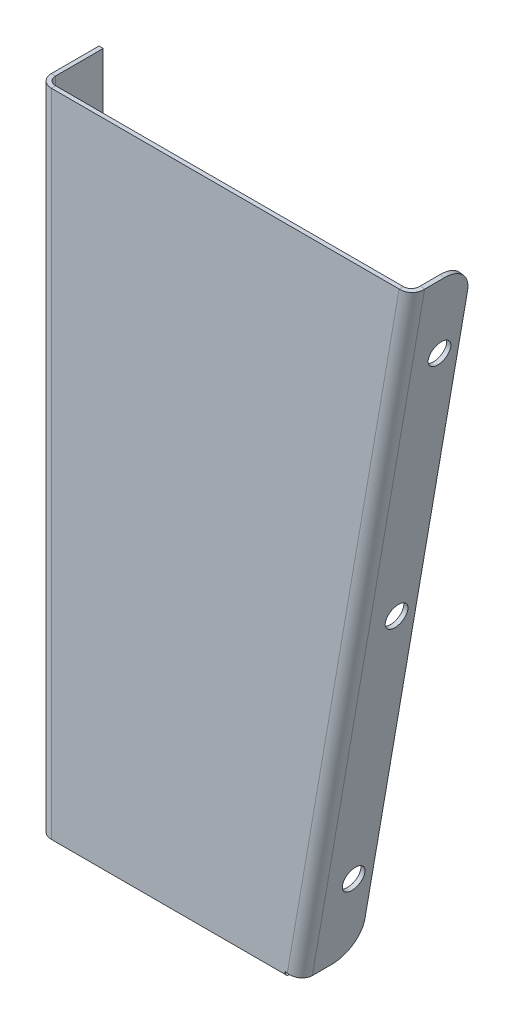
ISO-10303-21;
HEADER;
FILE_DESCRIPTION(('STEP AP214'),'2;1');
FILE_NAME('part.step','',(''),(''),'','','');
FILE_SCHEMA(('AUTOMOTIVE_DESIGN { 1 0 10303 214 1 1 1 1 }'));
ENDSEC;
DATA;
#1=APPLICATION_CONTEXT('core data for automotive mechanical design processes');
#2=APPLICATION_PROTOCOL_DEFINITION('international standard','automotive_design',2000,#1);
#3=PRODUCT_CONTEXT('',#1,'mechanical');
#4=PRODUCT('Part','Part','',(#3));
#5=PRODUCT_RELATED_PRODUCT_CATEGORY('part','',(#4));
#6=PRODUCT_DEFINITION_FORMATION('','',#4);
#7=PRODUCT_DEFINITION_CONTEXT('part definition',#1,'design');
#8=PRODUCT_DEFINITION('design','',#6,#7);
#9=PRODUCT_DEFINITION_SHAPE('','',#8);
#10=(LENGTH_UNIT() NAMED_UNIT(*) SI_UNIT(.MILLI.,.METRE.));
#11=(NAMED_UNIT(*) PLANE_ANGLE_UNIT() SI_UNIT($,.RADIAN.));
#12=(NAMED_UNIT(*) SI_UNIT($,.STERADIAN.) SOLID_ANGLE_UNIT());
#13=UNCERTAINTY_MEASURE_WITH_UNIT(LENGTH_MEASURE(1.E-05),#10,'distance_accuracy_value','');
#14=(GEOMETRIC_REPRESENTATION_CONTEXT(3) GLOBAL_UNCERTAINTY_ASSIGNED_CONTEXT((#13)) GLOBAL_UNIT_ASSIGNED_CONTEXT((#10,
#11,#12)) REPRESENTATION_CONTEXT('',''));
#15=CARTESIAN_POINT('',(0.,0.,0.));
#16=DIRECTION('',(0.,0.,1.));
#17=DIRECTION('',(1.,0.,0.));
#18=AXIS2_PLACEMENT_3D('',#15,#16,#17);
#19=CARTESIAN_POINT('',(135.953063944537,-62.3744510243497,1.5));
#20=DIRECTION('',(0.,-1.,0.));
#21=DIRECTION('',(1.,0.,0.));
#22=AXIS2_PLACEMENT_3D('',#19,#20,#21);
#23=PLANE('',#22);
#24=DIRECTION('',(0.,0.,1.));
#25=VECTOR('',#24,1.);
#26=CARTESIAN_POINT('',(131.386653634511,-62.3744510243496,0.));
#27=LINE('',#26,#25);
#28=CARTESIAN_POINT('',(131.386653634511,-62.3744510243496,0.));
#29=VERTEX_POINT('',#28);
#30=CARTESIAN_POINT('',(131.386653634511,-62.3744510243497,1.5));
#31=VERTEX_POINT('',#30);
#32=EDGE_CURVE('E263',#29,#31,#27,.T.);
#33=ORIENTED_EDGE('',*,*,#32,.F.);
#34=DIRECTION('',(-1.,0.,0.));
#35=VECTOR('',#34,1.);
#36=CARTESIAN_POINT('',(135.953063944537,-62.3744510243497,0.));
#37=LINE('',#36,#35);
#38=CARTESIAN_POINT('',(7.49999999999999,-62.3744510243497,0.));
#39=VERTEX_POINT('',#38);
#40=EDGE_CURVE('E352',#29,#39,#37,.T.);
#41=ORIENTED_EDGE('',*,*,#40,.T.);
#42=DIRECTION('',(0.,0.,1.));
#43=VECTOR('',#42,1.);
#44=CARTESIAN_POINT('',(7.49999999999999,-62.3744510243497,0.));
#45=LINE('',#44,#43);
#46=CARTESIAN_POINT('',(7.49999999999999,-62.3744510243497,1.49999999999998));
#47=VERTEX_POINT('',#46);
#48=EDGE_CURVE('E395',#39,#47,#45,.T.);
#49=ORIENTED_EDGE('',*,*,#48,.T.);
#50=DIRECTION('',(-1.,0.,0.));
#51=VECTOR('',#50,1.);
#52=CARTESIAN_POINT('',(135.953063944537,-62.3744510243497,1.5));
#53=LINE('',#52,#51);
#54=EDGE_CURVE('E351',#31,#47,#53,.T.);
#55=ORIENTED_EDGE('',*,*,#54,.F.);
#56=EDGE_LOOP('',(#33,#41,#49,#55));
#57=FACE_BOUND('',#56,.T.);
#58=ADVANCED_FACE('F80',(#57),#23,.F.);
#59=CARTESIAN_POINT('',(3.00000000000001,-294.07505479624,1.5));
#60=DIRECTION('',(0.,1.,0.));
#61=DIRECTION('',(0.,0.,1.));
#62=AXIS2_PLACEMENT_3D('',#59,#60,#61);
#63=PLANE('',#62);
#64=DIRECTION('',(0.,0.,1.));
#65=VECTOR('',#64,1.);
#66=CARTESIAN_POINT('',(91.5863208748659,-294.07505479624,0.));
#67=LINE('',#66,#65);
#68=CARTESIAN_POINT('',(91.5863208748658,-294.07505479624,0.));
#69=VERTEX_POINT('',#68);
#70=CARTESIAN_POINT('',(91.5863208748658,-294.07505479624,1.5));
#71=VERTEX_POINT('',#70);
#72=EDGE_CURVE('E372',#69,#71,#67,.T.);
#73=ORIENTED_EDGE('',*,*,#72,.T.);
#74=DIRECTION('',(1.,0.,0.));
#75=VECTOR('',#74,1.);
#76=CARTESIAN_POINT('',(3.00000000000001,-294.07505479624,1.5));
#77=LINE('',#76,#75);
#78=CARTESIAN_POINT('',(7.49999999999999,-294.07505479624,1.5));
#79=VERTEX_POINT('',#78);
#80=EDGE_CURVE('E346',#79,#71,#77,.T.);
#81=ORIENTED_EDGE('',*,*,#80,.F.);
#82=DIRECTION('',(0.,0.,1.));
#83=VECTOR('',#82,1.);
#84=CARTESIAN_POINT('',(7.49999999999999,-294.07505479624,0.));
#85=LINE('',#84,#83);
#86=CARTESIAN_POINT('',(7.49999999999999,-294.07505479624,0.));
#87=VERTEX_POINT('',#86);
#88=EDGE_CURVE('E385',#87,#79,#85,.T.);
#89=ORIENTED_EDGE('',*,*,#88,.F.);
#90=DIRECTION('',(1.,0.,0.));
#91=VECTOR('',#90,1.);
#92=CARTESIAN_POINT('',(3.00000000000001,-294.07505479624,0.));
#93=LINE('',#92,#91);
#94=EDGE_CURVE('E347',#87,#69,#93,.T.);
#95=ORIENTED_EDGE('',*,*,#94,.T.);
#96=EDGE_LOOP('',(#73,#81,#89,#95));
#97=FACE_BOUND('',#96,.T.);
#98=ADVANCED_FACE('F301',(#97),#63,.F.);
#99=CARTESIAN_POINT('',(0.,0.,1.5));
#100=DIRECTION('',(0.,0.,1.));
#101=DIRECTION('',(1.,0.,0.));
#102=AXIS2_PLACEMENT_3D('',#99,#100,#101);
#103=PLANE('',#102);
#104=ORIENTED_EDGE('',*,*,#80,.T.);
#105=DIRECTION('',(-0.985456779939458,0.169926263041812,0.));
#106=VECTOR('',#105,1.);
#107=CARTESIAN_POINT('',(-46.5997857229081,-270.247070478247,1.5));
#108=LINE('',#107,#106);
#109=CARTESIAN_POINT('',(90.6989072080366,-293.922034500225,1.5));
#110=VERTEX_POINT('',#109);
#111=EDGE_CURVE('E356',#71,#110,#108,.T.);
#112=ORIENTED_EDGE('',*,*,#111,.T.);
#113=DIRECTION('',(0.169926263041854,0.98545677993945,0.));
#114=VECTOR('',#113,1.);
#115=CARTESIAN_POINT('',(137.298692930955,-23.6749640219856,1.5));
#116=LINE('',#115,#114);
#117=CARTESIAN_POINT('',(90.8263519053179,-293.18294191527,1.5));
#118=VERTEX_POINT('',#117);
#119=EDGE_CURVE('E365',#110,#118,#116,.T.);
#120=ORIENTED_EDGE('',*,*,#119,.T.);
#121=DIRECTION('',(0.985456779939454,-0.169926263041836,0.));
#122=VECTOR('',#121,1.);
#123=CARTESIAN_POINT('',(-46.4723410256328,-269.507977893288,1.5));
#124=LINE('',#123,#122);
#125=CARTESIAN_POINT('',(91.5654444902725,-293.310386612552,1.49999999999999));
#126=VERTEX_POINT('',#125);
#127=EDGE_CURVE('E368',#118,#126,#124,.T.);
#128=ORIENTED_EDGE('',*,*,#127,.T.);
#129=DIRECTION('',(-0.169926263041851,-0.985456779939451,0.));
#130=VECTOR('',#129,1.);
#131=CARTESIAN_POINT('',(91.5654444902725,-293.310386612552,1.49999999999999));
#132=LINE('',#131,#130);
#133=EDGE_CURVE('E219',#126,#31,#132,.F.);
#134=ORIENTED_EDGE('',*,*,#133,.T.);
#135=ORIENTED_EDGE('',*,*,#54,.T.);
#136=DIRECTION('',(0.,1.,0.));
#137=VECTOR('',#136,1.);
#138=CARTESIAN_POINT('',(7.49999999999999,-62.3744510243497,1.49999999999998));
#139=LINE('',#138,#137);
#140=EDGE_CURVE('E419',#47,#79,#139,.F.);
#141=ORIENTED_EDGE('',*,*,#140,.T.);
#142=EDGE_LOOP('',(#104,#112,#120,#128,#134,#135,#141));
#143=FACE_BOUND('',#142,.T.);
#144=ADVANCED_FACE('F307',(#143),#103,.T.);
#145=CARTESIAN_POINT('',(0.,0.,0.));
#146=DIRECTION('',(0.,0.,1.));
#147=DIRECTION('',(1.,0.,0.));
#148=AXIS2_PLACEMENT_3D('',#145,#146,#147);
#149=PLANE('',#148);
#150=DIRECTION('',(-0.985456779939458,0.169926263041812,0.));
#151=VECTOR('',#150,1.);
#152=CARTESIAN_POINT('',(91.5863208748659,-294.07505479624,0.));
#153=LINE('',#152,#151);
#154=CARTESIAN_POINT('',(90.6989072080366,-293.922034500225,0.));
#155=VERTEX_POINT('',#154);
#156=EDGE_CURVE('E371',#69,#155,#153,.T.);
#157=ORIENTED_EDGE('',*,*,#156,.F.);
#158=ORIENTED_EDGE('',*,*,#94,.F.);
#159=DIRECTION('',(0.,1.,0.));
#160=VECTOR('',#159,1.);
#161=CARTESIAN_POINT('',(7.49999999999999,-62.3744510243497,0.));
#162=LINE('',#161,#160);
#163=EDGE_CURVE('E407',#39,#87,#162,.F.);
#164=ORIENTED_EDGE('',*,*,#163,.F.);
#165=ORIENTED_EDGE('',*,*,#40,.F.);
#166=DIRECTION('',(-0.169926263041851,-0.985456779939451,0.));
#167=VECTOR('',#166,1.);
#168=CARTESIAN_POINT('',(91.5654444902725,-293.310386612552,0.));
#169=LINE('',#168,#167);
#170=CARTESIAN_POINT('',(91.5654444902725,-293.310386612552,0.));
#171=VERTEX_POINT('',#170);
#172=EDGE_CURVE('E253',#171,#29,#169,.F.);
#173=ORIENTED_EDGE('',*,*,#172,.F.);
#174=DIRECTION('',(0.985456779939454,-0.169926263041836,0.));
#175=VECTOR('',#174,1.);
#176=CARTESIAN_POINT('',(90.8263519053179,-293.18294191527,0.));
#177=LINE('',#176,#175);
#178=CARTESIAN_POINT('',(90.8263519053179,-293.18294191527,0.));
#179=VERTEX_POINT('',#178);
#180=EDGE_CURVE('E380',#179,#171,#177,.T.);
#181=ORIENTED_EDGE('',*,*,#180,.F.);
#182=DIRECTION('',(0.169926263041854,0.98545677993945,0.));
#183=VECTOR('',#182,1.);
#184=CARTESIAN_POINT('',(90.6989072080366,-293.922034500225,0.));
#185=LINE('',#184,#183);
#186=EDGE_CURVE('E375',#155,#179,#185,.T.);
#187=ORIENTED_EDGE('',*,*,#186,.F.);
#188=EDGE_LOOP('',(#157,#158,#164,#165,#173,#181,#187));
#189=FACE_BOUND('',#188,.T.);
#190=ADVANCED_FACE('F527',(#189),#149,.F.);
#191=CARTESIAN_POINT('',(91.5863208748659,-294.07505479624,0.));
#192=DIRECTION('',(0.169926263041812,0.985456779939458,0.));
#193=DIRECTION('',(-0.985456779939458,0.169926263041812,0.));
#194=AXIS2_PLACEMENT_3D('',#191,#192,#193);
#195=PLANE('',#194);
#196=ORIENTED_EDGE('',*,*,#111,.F.);
#197=ORIENTED_EDGE('',*,*,#72,.F.);
#198=ORIENTED_EDGE('',*,*,#156,.T.);
#199=DIRECTION('',(0.,0.,1.));
#200=VECTOR('',#199,1.);
#201=CARTESIAN_POINT('',(90.6989072080366,-293.922034500225,0.));
#202=LINE('',#201,#200);
#203=EDGE_CURVE('E376',#155,#110,#202,.T.);
#204=ORIENTED_EDGE('',*,*,#203,.T.);
#205=EDGE_LOOP('',(#196,#197,#198,#204));
#206=FACE_BOUND('',#205,.T.);
#207=ADVANCED_FACE('F523',(#206),#195,.T.);
#208=CARTESIAN_POINT('',(90.6989072080366,-293.922034500225,0.));
#209=DIRECTION('',(0.98545677993945,-0.169926263041854,0.));
#210=DIRECTION('',(0.169926263041854,0.98545677993945,0.));
#211=AXIS2_PLACEMENT_3D('',#208,#209,#210);
#212=PLANE('',#211);
#213=ORIENTED_EDGE('',*,*,#119,.F.);
#214=ORIENTED_EDGE('',*,*,#203,.F.);
#215=ORIENTED_EDGE('',*,*,#186,.T.);
#216=DIRECTION('',(0.,0.,1.));
#217=VECTOR('',#216,1.);
#218=CARTESIAN_POINT('',(90.8263519053179,-293.18294191527,0.));
#219=LINE('',#218,#217);
#220=EDGE_CURVE('E381',#179,#118,#219,.T.);
#221=ORIENTED_EDGE('',*,*,#220,.T.);
#222=EDGE_LOOP('',(#213,#214,#215,#221));
#223=FACE_BOUND('',#222,.T.);
#224=ADVANCED_FACE('F519',(#223),#212,.T.);
#225=CARTESIAN_POINT('',(90.8263519053179,-293.18294191527,0.));
#226=DIRECTION('',(-0.169926263041836,-0.985456779939454,0.));
#227=DIRECTION('',(0.985456779939454,-0.169926263041836,0.));
#228=AXIS2_PLACEMENT_3D('',#225,#226,#227);
#229=PLANE('',#228);
#230=ORIENTED_EDGE('',*,*,#127,.F.);
#231=ORIENTED_EDGE('',*,*,#220,.F.);
#232=ORIENTED_EDGE('',*,*,#180,.T.);
#233=DIRECTION('',(0.,0.,1.));
#234=VECTOR('',#233,1.);
#235=CARTESIAN_POINT('',(91.5654444902725,-293.310386612552,0.));
#236=LINE('',#235,#234);
#237=EDGE_CURVE('E259',#171,#126,#236,.T.);
#238=ORIENTED_EDGE('',*,*,#237,.T.);
#239=EDGE_LOOP('',(#230,#231,#232,#238));
#240=FACE_BOUND('',#239,.T.);
#241=ADVANCED_FACE('F514',(#240),#229,.T.);
#242=CARTESIAN_POINT('',(7.5,-294.07505479624,-3.));
#243=DIRECTION('',(0.,-1.,0.));
#244=DIRECTION('',(0.,0.,-1.));
#245=AXIS2_PLACEMENT_3D('',#242,#243,#244);
#246=PLANE('',#245);
#247=DIRECTION('',(-1.,0.,0.));
#248=VECTOR('',#247,1.);
#249=CARTESIAN_POINT('',(3.,-294.07505479624,-2.99999999999999));
#250=LINE('',#249,#248);
#251=CARTESIAN_POINT('',(4.5,-294.07505479624,-2.99999999999999));
#252=VERTEX_POINT('',#251);
#253=CARTESIAN_POINT('',(3.,-294.07505479624,-2.99999999999998));
#254=VERTEX_POINT('',#253);
#255=EDGE_CURVE('E267',#252,#254,#250,.T.);
#256=ORIENTED_EDGE('',*,*,#255,.F.);
#257=CARTESIAN_POINT('',(7.5,-294.07505479624,-3.));
#258=DIRECTION('',(0.,1.,0.));
#259=DIRECTION('',(0.,0.,1.));
#260=AXIS2_PLACEMENT_3D('',#257,#258,#259);
#261=CIRCLE('',#260,2.99999999999999);
#262=EDGE_CURVE('E411',#87,#252,#261,.F.);
#263=ORIENTED_EDGE('',*,*,#262,.F.);
#264=ORIENTED_EDGE('',*,*,#88,.T.);
#265=CARTESIAN_POINT('',(7.5,-294.07505479624,-3.));
#266=DIRECTION('',(0.,1.,0.));
#267=DIRECTION('',(0.,0.,1.));
#268=AXIS2_PLACEMENT_3D('',#265,#266,#267);
#269=CIRCLE('',#268,4.49999999999999);
#270=EDGE_CURVE('E399',#79,#254,#269,.F.);
#271=ORIENTED_EDGE('',*,*,#270,.T.);
#272=EDGE_LOOP('',(#256,#263,#264,#271));
#273=FACE_BOUND('',#272,.T.);
#274=ADVANCED_FACE('F490',(#273),#246,.T.);
#275=CARTESIAN_POINT('',(7.5,-62.3744510243497,-3.00000000000001));
#276=DIRECTION('',(0.,-1.,0.));
#277=DIRECTION('',(0.,0.,-1.));
#278=AXIS2_PLACEMENT_3D('',#275,#276,#277);
#279=PLANE('',#278);
#280=CARTESIAN_POINT('',(7.5,-62.3744510243497,-3.00000000000001));
#281=DIRECTION('',(0.,1.,0.));
#282=DIRECTION('',(0.,0.,1.));
#283=AXIS2_PLACEMENT_3D('',#280,#281,#282);
#284=CIRCLE('',#283,2.99999999999999);
#285=CARTESIAN_POINT('',(4.5,-62.3744510243497,-3.));
#286=VERTEX_POINT('',#285);
#287=EDGE_CURVE('E403',#286,#39,#284,.T.);
#288=ORIENTED_EDGE('',*,*,#287,.F.);
#289=DIRECTION('',(-1.,0.,0.));
#290=VECTOR('',#289,1.);
#291=CARTESIAN_POINT('',(4.49999999999999,-62.3744510243497,-3.));
#292=LINE('',#291,#290);
#293=CARTESIAN_POINT('',(2.99999999999999,-62.3744510243497,-2.99999999999999));
#294=VERTEX_POINT('',#293);
#295=EDGE_CURVE('E432',#286,#294,#292,.T.);
#296=ORIENTED_EDGE('',*,*,#295,.T.);
#297=CARTESIAN_POINT('',(7.5,-62.3744510243497,-3.00000000000001));
#298=DIRECTION('',(0.,1.,0.));
#299=DIRECTION('',(0.,0.,1.));
#300=AXIS2_PLACEMENT_3D('',#297,#298,#299);
#301=CIRCLE('',#300,4.49999999999999);
#302=EDGE_CURVE('E415',#294,#47,#301,.T.);
#303=ORIENTED_EDGE('',*,*,#302,.T.);
#304=ORIENTED_EDGE('',*,*,#48,.F.);
#305=EDGE_LOOP('',(#288,#296,#303,#304));
#306=FACE_BOUND('',#305,.T.);
#307=ADVANCED_FACE('F483',(#306),#279,.F.);
#308=CARTESIAN_POINT('',(7.5,-62.3744510243497,-3.00000000000001));
#309=DIRECTION('',(0.,1.,0.));
#310=DIRECTION('',(-1.,0.,0.));
#311=AXIS2_PLACEMENT_3D('',#308,#309,#310);
#312=CYLINDRICAL_SURFACE('',#311,4.49999999999999);
#313=ORIENTED_EDGE('',*,*,#140,.F.);
#314=ORIENTED_EDGE('',*,*,#302,.F.);
#315=DIRECTION('',(0.,1.,0.));
#316=VECTOR('',#315,1.);
#317=CARTESIAN_POINT('',(2.99999999999999,0.,-3.));
#318=LINE('',#317,#316);
#319=EDGE_CURVE('E436',#254,#294,#318,.T.);
#320=ORIENTED_EDGE('',*,*,#319,.F.);
#321=ORIENTED_EDGE('',*,*,#270,.F.);
#322=EDGE_LOOP('',(#313,#314,#320,#321));
#323=FACE_BOUND('',#322,.T.);
#324=ADVANCED_FACE('F488',(#323),#312,.T.);
#325=CARTESIAN_POINT('',(7.5,-62.3744510243497,-3.00000000000001));
#326=DIRECTION('',(0.,1.,0.));
#327=DIRECTION('',(-1.,0.,0.));
#328=AXIS2_PLACEMENT_3D('',#325,#326,#327);
#329=CYLINDRICAL_SURFACE('',#328,2.99999999999999);
#330=ORIENTED_EDGE('',*,*,#163,.T.);
#331=ORIENTED_EDGE('',*,*,#262,.T.);
#332=DIRECTION('',(0.,-1.,0.));
#333=VECTOR('',#332,1.);
#334=CARTESIAN_POINT('',(4.5,-294.07505479624,-2.99999999999999));
#335=LINE('',#334,#333);
#336=EDGE_CURVE('E429',#252,#286,#335,.F.);
#337=ORIENTED_EDGE('',*,*,#336,.T.);
#338=ORIENTED_EDGE('',*,*,#287,.T.);
#339=EDGE_LOOP('',(#330,#331,#337,#338));
#340=FACE_BOUND('',#339,.T.);
#341=ADVANCED_FACE('F503',(#340),#329,.F.);
#342=CARTESIAN_POINT('',(3.,-62.3744510243497,0.));
#343=DIRECTION('',(0.,1.,0.));
#344=DIRECTION('',(-1.,0.,0.));
#345=AXIS2_PLACEMENT_3D('',#342,#343,#344);
#346=PLANE('',#345);
#347=DIRECTION('',(0.,0.,1.));
#348=VECTOR('',#347,1.);
#349=CARTESIAN_POINT('',(3.,-62.3744510243497,0.));
#350=LINE('',#349,#348);
#351=CARTESIAN_POINT('',(2.99999999999993,-62.3744510243497,-20.));
#352=VERTEX_POINT('',#351);
#353=EDGE_CURVE('E458',#352,#294,#350,.T.);
#354=ORIENTED_EDGE('',*,*,#353,.T.);
#355=ORIENTED_EDGE('',*,*,#295,.F.);
#356=DIRECTION('',(0.,0.,-1.));
#357=VECTOR('',#356,1.);
#358=CARTESIAN_POINT('',(4.5,-62.3744510243497,0.));
#359=LINE('',#358,#357);
#360=CARTESIAN_POINT('',(4.49999999999993,-62.3744510243497,-20.));
#361=VERTEX_POINT('',#360);
#362=EDGE_CURVE('E447',#361,#286,#359,.F.);
#363=ORIENTED_EDGE('',*,*,#362,.F.);
#364=DIRECTION('',(1.,0.,0.));
#365=VECTOR('',#364,1.);
#366=CARTESIAN_POINT('',(2.99999999999993,-62.3744510243497,-20.));
#367=LINE('',#366,#365);
#368=EDGE_CURVE('E408',#352,#361,#367,.T.);
#369=ORIENTED_EDGE('',*,*,#368,.F.);
#370=EDGE_LOOP('',(#354,#355,#363,#369));
#371=FACE_BOUND('',#370,.T.);
#372=ADVANCED_FACE('F480',(#371),#346,.T.);
#373=CARTESIAN_POINT('',(2.99999999999994,-294.07505479624,-20.));
#374=DIRECTION('',(0.,-1.,0.));
#375=DIRECTION('',(1.,0.,0.));
#376=AXIS2_PLACEMENT_3D('',#373,#374,#375);
#377=PLANE('',#376);
#378=DIRECTION('',(0.,0.,1.));
#379=VECTOR('',#378,1.);
#380=CARTESIAN_POINT('',(4.50000000000001,-294.07505479624,0.));
#381=LINE('',#380,#379);
#382=CARTESIAN_POINT('',(4.49999999999994,-294.07505479624,-20.));
#383=VERTEX_POINT('',#382);
#384=EDGE_CURVE('E440',#252,#383,#381,.F.);
#385=ORIENTED_EDGE('',*,*,#384,.F.);
#386=ORIENTED_EDGE('',*,*,#255,.T.);
#387=DIRECTION('',(0.,0.,-1.));
#388=VECTOR('',#387,1.);
#389=CARTESIAN_POINT('',(2.99999999999994,-294.07505479624,-20.));
#390=LINE('',#389,#388);
#391=CARTESIAN_POINT('',(2.99999999999994,-294.07505479624,-20.));
#392=VERTEX_POINT('',#391);
#393=EDGE_CURVE('E451',#254,#392,#390,.T.);
#394=ORIENTED_EDGE('',*,*,#393,.T.);
#395=DIRECTION('',(1.,0.,0.));
#396=VECTOR('',#395,1.);
#397=CARTESIAN_POINT('',(2.99999999999994,-294.07505479624,-20.));
#398=LINE('',#397,#396);
#399=EDGE_CURVE('E462',#392,#383,#398,.T.);
#400=ORIENTED_EDGE('',*,*,#399,.T.);
#401=EDGE_LOOP('',(#385,#386,#394,#400));
#402=FACE_BOUND('',#401,.T.);
#403=ADVANCED_FACE('F494',(#402),#377,.T.);
#404=CARTESIAN_POINT('',(3.,0.,0.));
#405=DIRECTION('',(-1.,0.,0.));
#406=DIRECTION('',(0.,0.,1.));
#407=AXIS2_PLACEMENT_3D('',#404,#405,#406);
#408=PLANE('',#407);
#409=CARTESIAN_POINT('',(2.99999999999997,-90.3289048412178,-10.));
#410=DIRECTION('',(-1.,0.,0.));
#411=DIRECTION('',(0.,0.,1.));
#412=AXIS2_PLACEMENT_3D('',#409,#410,#411);
#413=CIRCLE('',#412,4.);
#414=CARTESIAN_POINT('',(2.99999999999998,-90.3289048412178,-6.00000000000003));
#415=VERTEX_POINT('',#414);
#416=EDGE_CURVE('E599',#415,#415,#413,.T.);
#417=ORIENTED_EDGE('',*,*,#416,.F.);
#418=EDGE_LOOP('',(#417));
#419=FACE_BOUND('',#418,.T.);
#420=CARTESIAN_POINT('',(2.99999999999997,-150.328904841218,-10.));
#421=DIRECTION('',(-1.,0.,0.));
#422=DIRECTION('',(0.,0.,1.));
#423=AXIS2_PLACEMENT_3D('',#420,#421,#422);
#424=CIRCLE('',#423,4.);
#425=CARTESIAN_POINT('',(2.99999999999998,-150.328904841218,-6.00000000000003));
#426=VERTEX_POINT('',#425);
#427=EDGE_CURVE('E591',#426,#426,#424,.T.);
#428=ORIENTED_EDGE('',*,*,#427,.F.);
#429=EDGE_LOOP('',(#428));
#430=FACE_BOUND('',#429,.T.);
#431=CARTESIAN_POINT('',(2.99999999999997,-210.328904841218,-10.));
#432=DIRECTION('',(-1.,0.,0.));
#433=DIRECTION('',(0.,0.,1.));
#434=AXIS2_PLACEMENT_3D('',#431,#432,#433);
#435=CIRCLE('',#434,4.);
#436=CARTESIAN_POINT('',(2.99999999999999,-210.328904841218,-6.00000000000002));
#437=VERTEX_POINT('',#436);
#438=EDGE_CURVE('E583',#437,#437,#435,.T.);
#439=ORIENTED_EDGE('',*,*,#438,.F.);
#440=EDGE_LOOP('',(#439));
#441=FACE_BOUND('',#440,.T.);
#442=CARTESIAN_POINT('',(2.99999999999998,-270.328904841218,-10.));
#443=DIRECTION('',(-1.,0.,0.));
#444=DIRECTION('',(0.,0.,1.));
#445=AXIS2_PLACEMENT_3D('',#442,#443,#444);
#446=CIRCLE('',#445,4.);
#447=CARTESIAN_POINT('',(2.99999999999999,-270.328904841218,-6.00000000000002));
#448=VERTEX_POINT('',#447);
#449=EDGE_CURVE('E574',#448,#448,#446,.T.);
#450=ORIENTED_EDGE('',*,*,#449,.F.);
#451=EDGE_LOOP('',(#450));
#452=FACE_BOUND('',#451,.T.);
#453=ORIENTED_EDGE('',*,*,#393,.F.);
#454=ORIENTED_EDGE('',*,*,#319,.T.);
#455=ORIENTED_EDGE('',*,*,#353,.F.);
#456=DIRECTION('',(0.,1.,0.));
#457=VECTOR('',#456,1.);
#458=CARTESIAN_POINT('',(2.99999999999993,-62.3744510243497,-20.));
#459=LINE('',#458,#457);
#460=EDGE_CURVE('E454',#392,#352,#459,.T.);
#461=ORIENTED_EDGE('',*,*,#460,.F.);
#462=EDGE_LOOP('',(#453,#454,#455,#461));
#463=FACE_BOUND('',#462,.T.);
#464=ADVANCED_FACE('F486',(#419,#430,#441,#452,#463),#408,.T.);
#465=CARTESIAN_POINT('',(4.5,0.,0.));
#466=DIRECTION('',(-1.,0.,0.));
#467=DIRECTION('',(0.,0.,1.));
#468=AXIS2_PLACEMENT_3D('',#465,#466,#467);
#469=PLANE('',#468);
#470=CARTESIAN_POINT('',(4.49999999999997,-90.3289048412178,-10.));
#471=DIRECTION('',(-1.,0.,0.));
#472=DIRECTION('',(0.,0.,1.));
#473=AXIS2_PLACEMENT_3D('',#470,#471,#472);
#474=CIRCLE('',#473,4.);
#475=CARTESIAN_POINT('',(4.49999999999998,-90.3289048412178,-6.00000000000004));
#476=VERTEX_POINT('',#475);
#477=EDGE_CURVE('E249',#476,#476,#474,.T.);
#478=ORIENTED_EDGE('',*,*,#477,.T.);
#479=EDGE_LOOP('',(#478));
#480=FACE_BOUND('',#479,.T.);
#481=CARTESIAN_POINT('',(4.49999999999997,-150.328904841218,-10.));
#482=DIRECTION('',(-1.,0.,0.));
#483=DIRECTION('',(0.,0.,1.));
#484=AXIS2_PLACEMENT_3D('',#481,#482,#483);
#485=CIRCLE('',#484,4.);
#486=CARTESIAN_POINT('',(4.49999999999998,-150.328904841218,-6.00000000000004));
#487=VERTEX_POINT('',#486);
#488=EDGE_CURVE('E595',#487,#487,#485,.T.);
#489=ORIENTED_EDGE('',*,*,#488,.T.);
#490=EDGE_LOOP('',(#489));
#491=FACE_BOUND('',#490,.T.);
#492=CARTESIAN_POINT('',(4.49999999999997,-210.328904841218,-10.));
#493=DIRECTION('',(-1.,0.,0.));
#494=DIRECTION('',(0.,0.,1.));
#495=AXIS2_PLACEMENT_3D('',#492,#493,#494);
#496=CIRCLE('',#495,4.);
#497=CARTESIAN_POINT('',(4.49999999999999,-210.328904841218,-6.00000000000002));
#498=VERTEX_POINT('',#497);
#499=EDGE_CURVE('E587',#498,#498,#496,.T.);
#500=ORIENTED_EDGE('',*,*,#499,.T.);
#501=EDGE_LOOP('',(#500));
#502=FACE_BOUND('',#501,.T.);
#503=CARTESIAN_POINT('',(4.49999999999998,-270.328904841218,-10.));
#504=DIRECTION('',(-1.,0.,0.));
#505=DIRECTION('',(0.,0.,1.));
#506=AXIS2_PLACEMENT_3D('',#503,#504,#505);
#507=CIRCLE('',#506,4.);
#508=CARTESIAN_POINT('',(4.49999999999999,-270.328904841218,-6.00000000000002));
#509=VERTEX_POINT('',#508);
#510=EDGE_CURVE('E578',#509,#509,#507,.T.);
#511=ORIENTED_EDGE('',*,*,#510,.T.);
#512=EDGE_LOOP('',(#511));
#513=FACE_BOUND('',#512,.T.);
#514=ORIENTED_EDGE('',*,*,#336,.F.);
#515=ORIENTED_EDGE('',*,*,#384,.T.);
#516=DIRECTION('',(0.,-1.,0.));
#517=VECTOR('',#516,1.);
#518=CARTESIAN_POINT('',(4.49999999999993,0.,-20.));
#519=LINE('',#518,#517);
#520=EDGE_CURVE('E443',#383,#361,#519,.F.);
#521=ORIENTED_EDGE('',*,*,#520,.T.);
#522=ORIENTED_EDGE('',*,*,#362,.T.);
#523=EDGE_LOOP('',(#514,#515,#521,#522));
#524=FACE_BOUND('',#523,.T.);
#525=ADVANCED_FACE('F477',(#480,#491,#502,#513,#524),#469,.F.);
#526=CARTESIAN_POINT('',(2.99999999999993,-62.3744510243497,-20.));
#527=DIRECTION('',(0.,0.,-1.));
#528=DIRECTION('',(-1.,0.,0.));
#529=AXIS2_PLACEMENT_3D('',#526,#527,#528);
#530=PLANE('',#529);
#531=ORIENTED_EDGE('',*,*,#520,.F.);
#532=ORIENTED_EDGE('',*,*,#399,.F.);
#533=ORIENTED_EDGE('',*,*,#460,.T.);
#534=ORIENTED_EDGE('',*,*,#368,.T.);
#535=EDGE_LOOP('',(#531,#532,#533,#534));
#536=FACE_BOUND('',#535,.T.);
#537=ADVANCED_FACE('F469',(#536),#530,.T.);
#538=CARTESIAN_POINT('',(131.386653634511,-62.3744510243497,1.51500000000002));
#539=CARTESIAN_POINT('',(131.980164158944,-62.411163695619,1.51500000000001));
#540=CARTESIAN_POINT('',(132.573234075715,-62.4478237739833,1.39748663515745));
#541=CARTESIAN_POINT('',(133.671375979898,-62.505946712148,0.945145543419475));
#542=CARTESIAN_POINT('',(134.175918816162,-62.5273300197149,0.610495793427775));
#543=CARTESIAN_POINT('',(135.021556493261,-62.5419126417703,-0.22532155931327));
#544=CARTESIAN_POINT('',(135.36232725832,-62.5350560745736,-0.726160303625399));
#545=CARTESIAN_POINT('',(135.830065654068,-62.4844760086315,-1.81820830211786));
#546=CARTESIAN_POINT('',(135.956855938424,-62.4407336207672,-2.40888258269707));
#547=CARTESIAN_POINT('',(135.967845796236,-62.3769999182953,-3.));
#548=CARTESIAN_POINT('',(131.386653634511,-62.3744510243497,1.50000000000002));
#549=CARTESIAN_POINT('',(131.978228863973,-62.4108299866634,1.50000000000001));
#550=CARTESIAN_POINT('',(132.569364957306,-62.4471566063855,1.38287704500743));
#551=CARTESIAN_POINT('',(133.663931558818,-62.5046630407781,0.932038747594161));
#552=CARTESIAN_POINT('',(134.166834677685,-62.525763605301,0.598500790791802));
#553=CARTESIAN_POINT('',(135.009735936588,-62.5398743757972,-0.234539760112893));
#554=CARTESIAN_POINT('',(135.349411077511,-62.5328288857385,-0.733714588330963));
#555=CARTESIAN_POINT('',(135.815668534403,-62.4819934555727,-1.82213452038325));
#556=CARTESIAN_POINT('',(135.942074087012,-62.4381847251567,-2.41084643816312));
#557=CARTESIAN_POINT('',(135.953063944537,-62.3744510243496,-3.));
#558=CARTESIAN_POINT('',(131.386653634511,-62.3744510243496,0.));
#559=CARTESIAN_POINT('',(131.784699366881,-62.3774590910987,0.));
#560=CARTESIAN_POINT('',(132.182453116391,-62.3804398466131,-0.0780819699950431));
#561=CARTESIAN_POINT('',(132.919489450749,-62.376295903781,-0.378640834937223));
#562=CARTESIAN_POINT('',(133.258420830002,-62.3691221639161,-0.600999472805459));
#563=CARTESIAN_POINT('',(133.827680269287,-62.3360477784864,-1.15635984007526));
#564=CARTESIAN_POINT('',(134.057792996577,-62.3101100022337,-1.48914305888731));
#565=CARTESIAN_POINT('',(134.375956567855,-62.233738149696,-2.21475634692216));
#566=CARTESIAN_POINT('',(134.463888945811,-62.1832951641084,-2.60723198476853));
#567=CARTESIAN_POINT('',(134.474878774627,-62.1195616297869,-3.));
#568=CARTESIAN_POINT('',(131.386653634511,-62.3744510243496,-0.0151499999999796));
#569=CARTESIAN_POINT('',(131.78274471896,-62.3771220450535,-0.015149999999985));
#570=CARTESIAN_POINT('',(132.178545306797,-62.3797660073394,-0.092837656046568));
#571=CARTESIAN_POINT('',(132.911970585457,-62.3749993956973,-0.39187869872079));
#572=CARTESIAN_POINT('',(133.24924585014,-62.3675400853581,-0.613114425467791));
#573=CARTESIAN_POINT('',(133.815741507047,-62.3339891298535,-1.16567022288288));
#574=CARTESIAN_POINT('',(134.04474765396,-62.3078605415103,-1.49677288643992));
#575=CARTESIAN_POINT('',(134.361415476993,-62.2312307711067,-2.21872182737021));
#576=CARTESIAN_POINT('',(134.448959275885,-62.1807207795418,-2.60921547878925));
#577=CARTESIAN_POINT('',(134.459949104411,-62.1169872469018,-3.));
#578=B_SPLINE_SURFACE_WITH_KNOTS('',1,3,((#538,#539,#540,#541,#542,#543,#544,#545,#546,#547),
(#548,#549,#550,#551,#552,#553,#554,#555,#556,#557),(#558,#559,#560,#561,#562,#563,#564,#565,
#566,#567),(#568,#569,#570,#571,#572,#573,#574,#575,#576,#577)),.UNSPECIFIED.,.F.,.F.,.F.,(2,1,
1,2),(4,2,2,2,4),(-0.01,0.,1.,1.0101),(0.,0.25,0.5,0.75,1.),.UNSPECIFIED.);
#579=DIRECTION('',(0.985456779939451,-0.169926263041851,0.));
#580=VECTOR('',#579,1.);
#581=CARTESIAN_POINT('',(135.953063944537,-62.3744510243496,-3.));
#582=LINE('',#581,#580);
#583=CARTESIAN_POINT('',(134.474878774627,-62.1195616297868,-3.));
#584=VERTEX_POINT('',#583);
#585=CARTESIAN_POINT('',(135.953063944537,-62.3744510243496,-3.));
#586=VERTEX_POINT('',#585);
#587=EDGE_CURVE('E246',#584,#586,#582,.T.);
#588=CARTESIAN_POINT('',(131.386653634511,-62.3744510243496,0.));
#589=CARTESIAN_POINT('',(131.473323347612,-62.3751053938988,8.55121583674698E-06));
#590=CARTESIAN_POINT('',(131.559989091523,-62.3757598170839,-0.00365683537831571));
#591=CARTESIAN_POINT('',(131.732701110115,-62.3769631687007,-0.0182694302827804));
#592=CARTESIAN_POINT('',(131.81874741515,-62.3775121023361,-0.0292162793000287));
#593=CARTESIAN_POINT('',(131.989552338697,-62.3783986190093,-0.0583146227482495));
#594=CARTESIAN_POINT('',(132.074311891945,-62.3787363634114,-0.0764605991387528));
#595=CARTESIAN_POINT('',(132.241982897415,-62.3790960691108,-0.119806285482669));
#596=CARTESIAN_POINT('',(132.324894372692,-62.37911803435,-0.145005907380935));
#597=CARTESIAN_POINT('',(132.57006768472,-62.3785573264704,-0.230977889592989));
#598=CARTESIAN_POINT('',(132.728828488181,-62.377348500665,-0.302133662461352));
#599=CARTESIAN_POINT('',(133.032055077761,-62.3724908695212,-0.469943571922529));
#600=CARTESIAN_POINT('',(133.176523622176,-62.3688425360476,-0.566592775226828));
#601=CARTESIAN_POINT('',(133.447242066846,-62.3583965871664,-0.782601634993479));
#602=CARTESIAN_POINT('',(133.573492394403,-62.3515990456382,-0.901960758649903));
#603=CARTESIAN_POINT('',(133.804234225536,-62.3342493678824,-1.15994215106147));
#604=CARTESIAN_POINT('',(133.908720488399,-62.3236963289973,-1.29856904606155));
#605=CARTESIAN_POINT('',(134.093016568357,-62.2983281864745,-1.59103459939972));
#606=CARTESIAN_POINT('',(134.172820214917,-62.2835120188596,-1.74487704888597));
#607=CARTESIAN_POINT('',(134.305486547145,-62.2492442779468,-2.06322737597267));
#608=CARTESIAN_POINT('',(134.358369143495,-62.2297961461003,-2.22772726957254));
#609=CARTESIAN_POINT('',(134.420148140435,-62.1949233537305,-2.49459133668824));
#610=CARTESIAN_POINT('',(134.438184940832,-62.1810597634785,-2.59513476646379));
#611=CARTESIAN_POINT('',(134.464125809782,-62.1516115941386,-2.79710415072873));
#612=CARTESIAN_POINT('',(134.47204604765,-62.13602980467,-2.89852843541473));
#613=CARTESIAN_POINT('',(134.474878774627,-62.1195616297869,-3.));
#614=B_SPLINE_CURVE_WITH_KNOTS('',3,(#588,#589,#590,#591,#592,#593,#594,#595,#596,#597,#598,
#599,#600,#601,#602,#603,#604,#605,#606,#607,#608,#609,#610,#611,#612,#613),.UNSPECIFIED.,.F.,
.F.,(4,2,2,2,2,2,2,2,2,2,2,2,4),(0.,0.259931930276734,0.519851035545676,0.779571299806771,
1.03928832195907,1.5585417964192,2.07769486264646,2.59683575033121,3.1161015011928,
3.63549696120946,4.15450771862658,4.46329273489904,4.77158359959474),.UNSPECIFIED.);
#615=EDGE_CURVE('E223',#29,#584,#614,.T.);
#616=CARTESIAN_POINT('',(131.386653634511,-62.3744510243497,1.50000000000002));
#617=CARTESIAN_POINT('',(131.514506021694,-62.3823127722903,1.50001393746033));
#618=CARTESIAN_POINT('',(131.642356413152,-62.3901743957816,1.49459636740683));
#619=CARTESIAN_POINT('',(131.897148474053,-62.4057422506915,1.47299887254831));
#620=CARTESIAN_POINT('',(132.024090187345,-62.4134484896416,1.45681947066336));
#621=CARTESIAN_POINT('',(132.276076999208,-62.4285454891275,1.41381529683206));
#622=CARTESIAN_POINT('',(132.401123465469,-62.4359364849017,1.38699862210756));
#623=CARTESIAN_POINT('',(132.648535394822,-62.4502550765179,1.32291738490632));
#624=CARTESIAN_POINT('',(132.77090089092,-62.4571826780668,1.28565295112889));
#625=CARTESIAN_POINT('',(133.012130482014,-62.4704293475069,1.20092841058296));
#626=CARTESIAN_POINT('',(133.13099337666,-62.4767482084268,1.1534648537169));
#627=CARTESIAN_POINT('',(133.364379667423,-62.4886320987893,1.04867191291524));
#628=CARTESIAN_POINT('',(133.478901443256,-62.4941968487241,0.991338888683493));
#629=CARTESIAN_POINT('',(133.702689585704,-62.5044293438468,0.867266072051054));
#630=CARTESIAN_POINT('',(133.811958822124,-62.5090975831312,0.800531496516272));
#631=CARTESIAN_POINT('',(134.024580139793,-62.5174083771875,0.658085409266204));
#632=CARTESIAN_POINT('',(134.127930027322,-62.5210505536335,0.582370600979305));
#633=CARTESIAN_POINT('',(134.327903755871,-62.5271793297614,0.422559642087971));
#634=CARTESIAN_POINT('',(134.424530179,-62.5296663751708,0.338466739556327));
#635=CARTESIAN_POINT('',(134.610457601806,-62.5333723285482,0.162446965237237));
#636=CARTESIAN_POINT('',(134.699755857417,-62.5345907634571,0.070517184927573));
#637=CARTESIAN_POINT('',(134.870348553513,-62.5356497462083,-0.120473576281468));
#638=CARTESIAN_POINT('',(134.951644175232,-62.5354904977134,-0.219533500984134));
#639=CARTESIAN_POINT('',(135.105706022684,-62.5336974100737,-0.424120248086038));
#640=CARTESIAN_POINT('',(135.178469214345,-62.5320630481745,-0.529649350689448));
#641=CARTESIAN_POINT('',(135.314929006811,-62.5272293641368,-0.746387378068182));
#642=CARTESIAN_POINT('',(135.378625236526,-62.5240299779691,-0.857596535062321));
#643=CARTESIAN_POINT('',(135.496506301073,-62.5159906856849,-1.08488965175466));
#644=CARTESIAN_POINT('',(135.550691102766,-62.5111507738527,-1.20097362843569));
#645=CARTESIAN_POINT('',(135.649149127029,-62.4997690686421,-1.43711939970563));
#646=CARTESIAN_POINT('',(135.693427673223,-62.4932281934685,-1.55717901776506));
#647=CARTESIAN_POINT('',(135.771800574469,-62.4783957390041,-1.80043227067488));
#648=CARTESIAN_POINT('',(135.805897347578,-62.4701045761867,-1.92362515385619));
#649=CARTESIAN_POINT('',(135.871127547503,-62.4493595563054,-2.20433868609232));
#650=CARTESIAN_POINT('',(135.899238498421,-62.4363835540318,-2.3625322837838));
#651=CARTESIAN_POINT('',(135.938723440018,-62.4075714163612,-2.68049151762488));
#652=CARTESIAN_POINT('',(135.950122628117,-62.3917396273853,-2.84025442068946));
#653=CARTESIAN_POINT('',(135.953063944537,-62.3744510243496,-3.));
#654=B_SPLINE_CURVE_WITH_KNOTS('',3,(#616,#617,#618,#619,#620,#621,#622,#623,#624,#625,#626,
#627,#628,#629,#630,#631,#632,#633,#634,#635,#636,#637,#638,#639,#640,#641,#642,#643,#644,#645,
#646,#647,#648,#649,#650,#651,#652,#653),.UNSPECIFIED.,.F.,.F.,(4,2,2,2,2,2,2,2,2,2,2,2,2,2,2,2,
2,2,4),(0.,0.384164283207455,0.76830990114149,1.15216366217932,1.53601269497465,
1.91999177887843,2.30411279591062,2.68802149987885,3.07207157240543,3.45597332909462,
3.84001818982016,4.22400627814243,4.60813049851544,4.99227043570679,5.37641171127057,
5.76034605070888,6.14418913740547,6.62684535251156,7.1087730841141),.UNSPECIFIED.);
#655=EDGE_CURVE('E258',#31,#586,#654,.T.);
#656=ORIENTED_EDGE('',*,*,#587,.F.);
#657=ORIENTED_EDGE('',*,*,#615,.F.);
#658=ORIENTED_EDGE('',*,*,#32,.T.);
#659=ORIENTED_EDGE('',*,*,#655,.T.);
#660=EDGE_LOOP('',(#656,#657,#658,#659));
#661=FACE_BOUND('',#660,.T.);
#662=ADVANCED_FACE('F282',(#661),#578,.F.);
#663=CARTESIAN_POINT('',(91.5654444902726,-293.310386612552,-3.00000000000004));
#664=DIRECTION('',(0.169926263041851,0.985456779939451,0.));
#665=DIRECTION('',(-0.985456779939451,0.169926263041851,0.));
#666=AXIS2_PLACEMENT_3D('',#663,#664,#665);
#667=PLANE('',#666);
#668=CARTESIAN_POINT('',(91.5654444902726,-293.310386612552,-3.00000000000004));
#669=DIRECTION('',(-0.169926263041851,-0.985456779939451,0.));
#670=DIRECTION('',(0.985456779939451,-0.169926263041851,0.));
#671=AXIS2_PLACEMENT_3D('',#668,#669,#670);
#672=CIRCLE('',#671,3.00000000000003);
#673=CARTESIAN_POINT('',(94.5218148300909,-293.820165401677,-3.00000000000003));
#674=VERTEX_POINT('',#673);
#675=EDGE_CURVE('E209',#674,#171,#672,.T.);
#676=ORIENTED_EDGE('',*,*,#675,.F.);
#677=DIRECTION('',(0.985456779939451,-0.169926263041851,0.));
#678=VECTOR('',#677,1.);
#679=CARTESIAN_POINT('',(94.5218148300909,-293.820165401677,-3.00000000000003));
#680=LINE('',#679,#678);
#681=CARTESIAN_POINT('',(96.,-294.07505479624,-3.00000000000003));
#682=VERTEX_POINT('',#681);
#683=EDGE_CURVE('E205',#674,#682,#680,.T.);
#684=ORIENTED_EDGE('',*,*,#683,.T.);
#685=CARTESIAN_POINT('',(91.5654444902726,-293.310386612552,-3.00000000000004));
#686=DIRECTION('',(-0.169926263041851,-0.985456779939451,0.));
#687=DIRECTION('',(0.985456779939451,-0.169926263041851,0.));
#688=AXIS2_PLACEMENT_3D('',#685,#686,#687);
#689=CIRCLE('',#688,4.50000000000003);
#690=EDGE_CURVE('E214',#682,#126,#689,.T.);
#691=ORIENTED_EDGE('',*,*,#690,.T.);
#692=ORIENTED_EDGE('',*,*,#237,.F.);
#693=EDGE_LOOP('',(#676,#684,#691,#692));
#694=FACE_BOUND('',#693,.T.);
#695=ADVANCED_FACE('F226',(#694),#667,.F.);
#696=CARTESIAN_POINT('',(91.5654444902725,-293.310386612552,-3.00000000000004));
#697=DIRECTION('',(-0.169926263041851,-0.985456779939451,0.));
#698=DIRECTION('',(0.985456779939451,-0.169926263041851,0.));
#699=AXIS2_PLACEMENT_3D('',#696,#697,#698);
#700=CYLINDRICAL_SURFACE('',#699,4.50000000000003);
#701=ORIENTED_EDGE('',*,*,#133,.F.);
#702=ORIENTED_EDGE('',*,*,#690,.F.);
#703=DIRECTION('',(-0.169926263041851,-0.985456779939451,0.));
#704=VECTOR('',#703,1.);
#705=CARTESIAN_POINT('',(135.953063944537,-62.3744510243496,-3.));
#706=LINE('',#705,#704);
#707=EDGE_CURVE('E216',#682,#586,#706,.F.);
#708=ORIENTED_EDGE('',*,*,#707,.T.);
#709=ORIENTED_EDGE('',*,*,#655,.F.);
#710=EDGE_LOOP('',(#701,#702,#708,#709));
#711=FACE_BOUND('',#710,.T.);
#712=ADVANCED_FACE('F215',(#711),#700,.T.);
#713=CARTESIAN_POINT('',(91.5654444902725,-293.310386612552,-3.00000000000004));
#714=DIRECTION('',(-0.169926263041851,-0.985456779939451,0.));
#715=DIRECTION('',(0.985456779939451,-0.169926263041851,0.));
#716=AXIS2_PLACEMENT_3D('',#713,#714,#715);
#717=CYLINDRICAL_SURFACE('',#716,3.00000000000003);
#718=ORIENTED_EDGE('',*,*,#172,.T.);
#719=ORIENTED_EDGE('',*,*,#615,.T.);
#720=DIRECTION('',(-0.169926263041851,-0.985456779939451,0.));
#721=VECTOR('',#720,1.);
#722=CARTESIAN_POINT('',(134.474878774627,-62.1195616297869,-3.));
#723=LINE('',#722,#721);
#724=EDGE_CURVE('E229',#584,#674,#723,.T.);
#725=ORIENTED_EDGE('',*,*,#724,.T.);
#726=ORIENTED_EDGE('',*,*,#675,.T.);
#727=EDGE_LOOP('',(#718,#719,#725,#726));
#728=FACE_BOUND('',#727,.T.);
#729=ADVANCED_FACE('F290',(#728),#717,.F.);
#730=CARTESIAN_POINT('',(135.953063944537,-62.3744510243496,0.));
#731=DIRECTION('',(0.169926263041851,0.985456779939451,0.));
#732=DIRECTION('',(-0.985456779939451,0.169926263041851,0.));
#733=AXIS2_PLACEMENT_3D('',#730,#731,#732);
#734=PLANE('',#733);
#735=DIRECTION('',(0.,0.,1.));
#736=VECTOR('',#735,1.);
#737=CARTESIAN_POINT('',(135.953063944537,-62.3744510243496,0.));
#738=LINE('',#737,#736);
#739=CARTESIAN_POINT('',(135.953063944537,-62.3744510243497,-9.99999999999999));
#740=VERTEX_POINT('',#739);
#741=EDGE_CURVE('E232',#586,#740,#738,.F.);
#742=ORIENTED_EDGE('',*,*,#741,.T.);
#743=DIRECTION('',(-0.985456779939451,0.169926263041851,0.));
#744=VECTOR('',#743,1.);
#745=CARTESIAN_POINT('',(135.953063944537,-62.3744510243497,-9.99999999999999));
#746=LINE('',#745,#744);
#747=CARTESIAN_POINT('',(134.474878774627,-62.1195616297869,-10.));
#748=VERTEX_POINT('',#747);
#749=EDGE_CURVE('E13',#740,#748,#746,.T.);
#750=ORIENTED_EDGE('',*,*,#749,.T.);
#751=DIRECTION('',(0.,0.,-1.));
#752=VECTOR('',#751,1.);
#753=CARTESIAN_POINT('',(134.474878774627,-62.1195616297869,4.20626524446144E-13));
#754=LINE('',#753,#752);
#755=EDGE_CURVE('E234',#584,#748,#754,.T.);
#756=ORIENTED_EDGE('',*,*,#755,.F.);
#757=ORIENTED_EDGE('',*,*,#587,.T.);
#758=EDGE_LOOP('',(#742,#750,#756,#757));
#759=FACE_BOUND('',#758,.T.);
#760=ADVANCED_FACE('F291',(#759),#734,.T.);
#761=CARTESIAN_POINT('',(96.0000000000001,-294.07505479624,-20.));
#762=DIRECTION('',(-0.169926263041851,-0.985456779939451,0.));
#763=DIRECTION('',(0.985456779939451,-0.169926263041851,0.));
#764=AXIS2_PLACEMENT_3D('',#761,#762,#763);
#765=PLANE('',#764);
#766=DIRECTION('',(0.,0.,1.));
#767=VECTOR('',#766,1.);
#768=CARTESIAN_POINT('',(94.5218148300909,-293.820165401677,1.03153526586914E-12));
#769=LINE('',#768,#767);
#770=CARTESIAN_POINT('',(94.5218148300909,-293.820165401677,-9.99999999999998));
#771=VERTEX_POINT('',#770);
#772=EDGE_CURVE('E563',#771,#674,#769,.T.);
#773=ORIENTED_EDGE('',*,*,#772,.F.);
#774=DIRECTION('',(-0.985456779939451,0.169926263041851,0.));
#775=VECTOR('',#774,1.);
#776=CARTESIAN_POINT('',(96.0000000000001,-294.07505479624,-9.99999999999997));
#777=LINE('',#776,#775);
#778=CARTESIAN_POINT('',(96.0000000000001,-294.07505479624,-9.99999999999997));
#779=VERTEX_POINT('',#778);
#780=EDGE_CURVE('E104',#771,#779,#777,.F.);
#781=ORIENTED_EDGE('',*,*,#780,.T.);
#782=DIRECTION('',(0.,0.,-1.));
#783=VECTOR('',#782,1.);
#784=CARTESIAN_POINT('',(96.0000000000001,-294.07505479624,-20.));
#785=LINE('',#784,#783);
#786=EDGE_CURVE('E201',#779,#682,#785,.F.);
#787=ORIENTED_EDGE('',*,*,#786,.T.);
#788=ORIENTED_EDGE('',*,*,#683,.F.);
#789=EDGE_LOOP('',(#773,#781,#787,#788));
#790=FACE_BOUND('',#789,.T.);
#791=ADVANCED_FACE('F203',(#790),#765,.T.);
#792=CARTESIAN_POINT('',(142.472341025637,-24.5670769029547,4.1772423947141E-13));
#793=DIRECTION('',(-0.985456779939451,0.169926263041851,0.));
#794=DIRECTION('',(-0.169926263041851,-0.985456779939451,0.));
#795=AXIS2_PLACEMENT_3D('',#792,#793,#794);
#796=PLANE('',#795);
#797=CARTESIAN_POINT('',(100.683168298502,-266.915863104845,-13.));
#798=DIRECTION('',(0.985456779939451,-0.169926263041851,0.));
#799=DIRECTION('',(0.169926263041851,0.985456779939451,0.));
#800=AXIS2_PLACEMENT_3D('',#797,#798,#799);
#801=CIRCLE('',#800,4.);
#802=CARTESIAN_POINT('',(101.362873350669,-262.974035985087,-13.));
#803=VERTEX_POINT('',#802);
#804=EDGE_CURVE('E614',#803,#803,#801,.T.);
#805=ORIENTED_EDGE('',*,*,#804,.F.);
#806=EDGE_LOOP('',(#805));
#807=FACE_BOUND('',#806,.T.);
#808=CARTESIAN_POINT('',(131.269895646035,-89.5336427157441,-13.));
#809=DIRECTION('',(0.985456779939451,-0.169926263041851,0.));
#810=DIRECTION('',(0.169926263041851,0.985456779939451,0.));
#811=AXIS2_PLACEMENT_3D('',#808,#809,#810);
#812=CIRCLE('',#811,3.99999999999999);
#813=CARTESIAN_POINT('',(131.949600698202,-85.5918155959863,-13.));
#814=VERTEX_POINT('',#813);
#815=EDGE_CURVE('E622',#814,#814,#812,.T.);
#816=ORIENTED_EDGE('',*,*,#815,.F.);
#817=EDGE_LOOP('',(#816));
#818=FACE_BOUND('',#817,.T.);
#819=CARTESIAN_POINT('',(115.976531972268,-178.224752910295,-13.));
#820=DIRECTION('',(0.985456779939451,-0.169926263041851,0.));
#821=DIRECTION('',(0.169926263041851,0.985456779939451,0.));
#822=AXIS2_PLACEMENT_3D('',#819,#820,#821);
#823=CIRCLE('',#822,4.);
#824=CARTESIAN_POINT('',(116.656237024436,-174.282925790537,-13.));
#825=VERTEX_POINT('',#824);
#826=EDGE_CURVE('E606',#825,#825,#823,.T.);
#827=ORIENTED_EDGE('',*,*,#826,.F.);
#828=EDGE_LOOP('',(#827));
#829=FACE_BOUND('',#828,.T.);
#830=ORIENTED_EDGE('',*,*,#786,.F.);
#831=CARTESIAN_POINT('',(97.6992626304186,-284.220486996845,-9.99999999999999));
#832=DIRECTION('',(-0.985456779939451,0.169926263041851,0.));
#833=DIRECTION('',(-0.169926263041851,-0.985456779939451,0.));
#834=AXIS2_PLACEMENT_3D('',#831,#832,#833);
#835=CIRCLE('',#834,10.);
#836=CARTESIAN_POINT('',(97.6992626304186,-284.220486996845,-20.));
#837=VERTEX_POINT('',#836);
#838=EDGE_CURVE('E89',#779,#837,#835,.F.);
#839=ORIENTED_EDGE('',*,*,#838,.T.);
#840=DIRECTION('',(0.169926263041851,0.985456779939451,0.));
#841=VECTOR('',#840,1.);
#842=CARTESIAN_POINT('',(135.953063944537,-62.3744510243497,-20.));
#843=LINE('',#842,#841);
#844=CARTESIAN_POINT('',(134.253801314118,-72.2290188237442,-20.));
#845=VERTEX_POINT('',#844);
#846=EDGE_CURVE('E210',#845,#837,#843,.F.);
#847=ORIENTED_EDGE('',*,*,#846,.F.);
#848=CARTESIAN_POINT('',(134.253801314118,-72.2290188237442,-9.99999999999999));
#849=DIRECTION('',(-0.985456779939451,0.169926263041851,0.));
#850=DIRECTION('',(-0.169926263041851,-0.985456779939451,0.));
#851=AXIS2_PLACEMENT_3D('',#848,#849,#850);
#852=CIRCLE('',#851,10.);
#853=EDGE_CURVE('E96',#845,#740,#852,.F.);
#854=ORIENTED_EDGE('',*,*,#853,.T.);
#855=ORIENTED_EDGE('',*,*,#741,.F.);
#856=ORIENTED_EDGE('',*,*,#707,.F.);
#857=EDGE_LOOP('',(#830,#839,#847,#854,#855,#856));
#858=FACE_BOUND('',#857,.T.);
#859=ADVANCED_FACE('F231',(#807,#818,#829,#858),#796,.F.);
#860=CARTESIAN_POINT('',(140.994155855727,-24.312187508392,4.12487017463146E-13));
#861=DIRECTION('',(-0.985456779939451,0.169926263041851,0.));
#862=DIRECTION('',(-0.169926263041851,-0.985456779939451,0.));
#863=AXIS2_PLACEMENT_3D('',#860,#861,#862);
#864=PLANE('',#863);
#865=CARTESIAN_POINT('',(99.2049831285926,-266.660973710283,-13.));
#866=DIRECTION('',(0.985456779939451,-0.169926263041851,0.));
#867=DIRECTION('',(0.169926263041851,0.985456779939451,0.));
#868=AXIS2_PLACEMENT_3D('',#865,#866,#867);
#869=CIRCLE('',#868,4.);
#870=CARTESIAN_POINT('',(99.88468818076,-262.719146590525,-13.));
#871=VERTEX_POINT('',#870);
#872=EDGE_CURVE('E618',#871,#871,#869,.T.);
#873=ORIENTED_EDGE('',*,*,#872,.T.);
#874=EDGE_LOOP('',(#873));
#875=FACE_BOUND('',#874,.T.);
#876=CARTESIAN_POINT('',(129.791710476126,-89.2787533211814,-13.));
#877=DIRECTION('',(0.985456779939451,-0.169926263041851,0.));
#878=DIRECTION('',(0.169926263041851,0.985456779939451,0.));
#879=AXIS2_PLACEMENT_3D('',#876,#877,#878);
#880=CIRCLE('',#879,3.99999999999999);
#881=CARTESIAN_POINT('',(130.471415528293,-85.3369262014236,-13.));
#882=VERTEX_POINT('',#881);
#883=EDGE_CURVE('E610',#882,#882,#880,.T.);
#884=ORIENTED_EDGE('',*,*,#883,.T.);
#885=EDGE_LOOP('',(#884));
#886=FACE_BOUND('',#885,.T.);
#887=CARTESIAN_POINT('',(114.498346802359,-177.969863515732,-13.));
#888=DIRECTION('',(0.985456779939451,-0.169926263041851,0.));
#889=DIRECTION('',(0.169926263041851,0.985456779939451,0.));
#890=AXIS2_PLACEMENT_3D('',#887,#888,#889);
#891=CIRCLE('',#890,4.);
#892=CARTESIAN_POINT('',(115.178051854527,-174.028036395974,-13.));
#893=VERTEX_POINT('',#892);
#894=EDGE_CURVE('E579',#893,#893,#891,.T.);
#895=ORIENTED_EDGE('',*,*,#894,.T.);
#896=EDGE_LOOP('',(#895));
#897=FACE_BOUND('',#896,.T.);
#898=DIRECTION('',(-0.169926263041851,-0.985456779939451,0.));
#899=VECTOR('',#898,1.);
#900=CARTESIAN_POINT('',(140.994155855727,-24.312187508392,-20.));
#901=LINE('',#900,#899);
#902=CARTESIAN_POINT('',(132.775616144209,-71.9741294291814,-20.));
#903=VERTEX_POINT('',#902);
#904=CARTESIAN_POINT('',(96.2210774605094,-283.965597602283,-20.));
#905=VERTEX_POINT('',#904);
#906=EDGE_CURVE('E239',#903,#905,#901,.T.);
#907=ORIENTED_EDGE('',*,*,#906,.T.);
#908=CARTESIAN_POINT('',(96.2210774605094,-283.965597602283,-10.));
#909=DIRECTION('',(-0.985456779939451,0.169926263041851,0.));
#910=DIRECTION('',(-0.169926263041851,-0.985456779939451,0.));
#911=AXIS2_PLACEMENT_3D('',#908,#909,#910);
#912=CIRCLE('',#911,10.);
#913=EDGE_CURVE('E335',#905,#771,#912,.T.);
#914=ORIENTED_EDGE('',*,*,#913,.T.);
#915=ORIENTED_EDGE('',*,*,#772,.T.);
#916=ORIENTED_EDGE('',*,*,#724,.F.);
#917=ORIENTED_EDGE('',*,*,#755,.T.);
#918=CARTESIAN_POINT('',(132.775616144209,-71.9741294291814,-10.));
#919=DIRECTION('',(-0.985456779939451,0.169926263041851,0.));
#920=DIRECTION('',(-0.169926263041851,-0.985456779939451,0.));
#921=AXIS2_PLACEMENT_3D('',#918,#919,#920);
#922=CIRCLE('',#921,10.);
#923=EDGE_CURVE('E338',#748,#903,#922,.T.);
#924=ORIENTED_EDGE('',*,*,#923,.T.);
#925=EDGE_LOOP('',(#907,#914,#915,#916,#917,#924));
#926=FACE_BOUND('',#925,.T.);
#927=ADVANCED_FACE('F631',(#875,#886,#897,#926),#864,.T.);
#928=CARTESIAN_POINT('',(135.953063944537,-62.3744510243497,-20.));
#929=DIRECTION('',(0.,0.,-1.));
#930=DIRECTION('',(-1.,0.,0.));
#931=AXIS2_PLACEMENT_3D('',#928,#929,#930);
#932=PLANE('',#931);
#933=ORIENTED_EDGE('',*,*,#846,.T.);
#934=DIRECTION('',(-0.985456779939451,0.169926263041851,0.));
#935=VECTOR('',#934,1.);
#936=CARTESIAN_POINT('',(97.6992626304186,-284.220486996845,-20.));
#937=LINE('',#936,#935);
#938=EDGE_CURVE('E326',#837,#905,#937,.T.);
#939=ORIENTED_EDGE('',*,*,#938,.T.);
#940=ORIENTED_EDGE('',*,*,#906,.F.);
#941=DIRECTION('',(-0.985456779939451,0.169926263041851,0.));
#942=VECTOR('',#941,1.);
#943=CARTESIAN_POINT('',(134.253801314118,-72.2290188237442,-20.));
#944=LINE('',#943,#942);
#945=EDGE_CURVE('E343',#903,#845,#944,.F.);
#946=ORIENTED_EDGE('',*,*,#945,.T.);
#947=EDGE_LOOP('',(#933,#939,#940,#946));
#948=FACE_BOUND('',#947,.T.);
#949=ADVANCED_FACE('F667',(#948),#932,.T.);
#950=CARTESIAN_POINT('',(4.49999999999998,-270.328904841218,-10.));
#951=DIRECTION('',(-1.,0.,0.));
#952=DIRECTION('',(0.,0.,1.));
#953=AXIS2_PLACEMENT_3D('',#950,#951,#952);
#954=CYLINDRICAL_SURFACE('',#953,4.);
#955=ORIENTED_EDGE('',*,*,#510,.F.);
#956=EDGE_LOOP('',(#955));
#957=FACE_BOUND('',#956,.T.);
#958=ORIENTED_EDGE('',*,*,#449,.T.);
#959=EDGE_LOOP('',(#958));
#960=FACE_BOUND('',#959,.T.);
#961=ADVANCED_FACE('F664',(#957,#960),#954,.F.);
#962=CARTESIAN_POINT('',(4.49999999999997,-210.328904841218,-10.));
#963=DIRECTION('',(-1.,0.,0.));
#964=DIRECTION('',(0.,0.,1.));
#965=AXIS2_PLACEMENT_3D('',#962,#963,#964);
#966=CYLINDRICAL_SURFACE('',#965,4.);
#967=ORIENTED_EDGE('',*,*,#499,.F.);
#968=EDGE_LOOP('',(#967));
#969=FACE_BOUND('',#968,.T.);
#970=ORIENTED_EDGE('',*,*,#438,.T.);
#971=EDGE_LOOP('',(#970));
#972=FACE_BOUND('',#971,.T.);
#973=ADVANCED_FACE('F660',(#969,#972),#966,.F.);
#974=CARTESIAN_POINT('',(4.49999999999997,-150.328904841218,-10.));
#975=DIRECTION('',(-1.,0.,0.));
#976=DIRECTION('',(0.,0.,1.));
#977=AXIS2_PLACEMENT_3D('',#974,#975,#976);
#978=CYLINDRICAL_SURFACE('',#977,4.);
#979=ORIENTED_EDGE('',*,*,#488,.F.);
#980=EDGE_LOOP('',(#979));
#981=FACE_BOUND('',#980,.T.);
#982=ORIENTED_EDGE('',*,*,#427,.T.);
#983=EDGE_LOOP('',(#982));
#984=FACE_BOUND('',#983,.T.);
#985=ADVANCED_FACE('F653',(#981,#984),#978,.F.);
#986=CARTESIAN_POINT('',(4.49999999999997,-90.3289048412178,-10.));
#987=DIRECTION('',(-1.,0.,0.));
#988=DIRECTION('',(0.,0.,1.));
#989=AXIS2_PLACEMENT_3D('',#986,#987,#988);
#990=CYLINDRICAL_SURFACE('',#989,4.);
#991=ORIENTED_EDGE('',*,*,#477,.F.);
#992=EDGE_LOOP('',(#991));
#993=FACE_BOUND('',#992,.T.);
#994=ORIENTED_EDGE('',*,*,#416,.T.);
#995=EDGE_LOOP('',(#994));
#996=FACE_BOUND('',#995,.T.);
#997=ADVANCED_FACE('F647',(#993,#996),#990,.F.);
#998=CARTESIAN_POINT('',(114.498346802359,-177.969863515732,-13.));
#999=DIRECTION('',(0.985456779939451,-0.169926263041851,0.));
#1000=DIRECTION('',(0.169926263041851,0.985456779939451,0.));
#1001=AXIS2_PLACEMENT_3D('',#998,#999,#1000);
#1002=CYLINDRICAL_SURFACE('',#1001,4.);
#1003=ORIENTED_EDGE('',*,*,#894,.F.);
#1004=EDGE_LOOP('',(#1003));
#1005=FACE_BOUND('',#1004,.T.);
#1006=ORIENTED_EDGE('',*,*,#826,.T.);
#1007=EDGE_LOOP('',(#1006));
#1008=FACE_BOUND('',#1007,.T.);
#1009=ADVANCED_FACE('F636',(#1005,#1008),#1002,.F.);
#1010=CARTESIAN_POINT('',(129.791710476126,-89.2787533211814,-13.));
#1011=DIRECTION('',(0.985456779939451,-0.169926263041851,0.));
#1012=DIRECTION('',(0.169926263041851,0.985456779939451,0.));
#1013=AXIS2_PLACEMENT_3D('',#1010,#1011,#1012);
#1014=CYLINDRICAL_SURFACE('',#1013,3.99999999999999);
#1015=ORIENTED_EDGE('',*,*,#883,.F.);
#1016=EDGE_LOOP('',(#1015));
#1017=FACE_BOUND('',#1016,.T.);
#1018=ORIENTED_EDGE('',*,*,#815,.T.);
#1019=EDGE_LOOP('',(#1018));
#1020=FACE_BOUND('',#1019,.T.);
#1021=ADVANCED_FACE('F321',(#1017,#1020),#1014,.F.);
#1022=CARTESIAN_POINT('',(99.2049831285926,-266.660973710283,-13.));
#1023=DIRECTION('',(0.985456779939451,-0.169926263041851,0.));
#1024=DIRECTION('',(0.169926263041851,0.985456779939451,0.));
#1025=AXIS2_PLACEMENT_3D('',#1022,#1023,#1024);
#1026=CYLINDRICAL_SURFACE('',#1025,4.);
#1027=ORIENTED_EDGE('',*,*,#872,.F.);
#1028=EDGE_LOOP('',(#1027));
#1029=FACE_BOUND('',#1028,.T.);
#1030=ORIENTED_EDGE('',*,*,#804,.T.);
#1031=EDGE_LOOP('',(#1030));
#1032=FACE_BOUND('',#1031,.T.);
#1033=ADVANCED_FACE('F314',(#1029,#1032),#1026,.F.);
#1034=CARTESIAN_POINT('',(97.6992626304186,-284.220486996845,-9.99999999999999));
#1035=DIRECTION('',(-0.985456779939451,0.169926263041851,0.));
#1036=DIRECTION('',(-0.169926263041851,-0.985456779939451,0.));
#1037=AXIS2_PLACEMENT_3D('',#1034,#1035,#1036);
#1038=CYLINDRICAL_SURFACE('',#1037,10.);
#1039=ORIENTED_EDGE('',*,*,#838,.F.);
#1040=ORIENTED_EDGE('',*,*,#780,.F.);
#1041=ORIENTED_EDGE('',*,*,#913,.F.);
#1042=ORIENTED_EDGE('',*,*,#938,.F.);
#1043=EDGE_LOOP('',(#1039,#1040,#1041,#1042));
#1044=FACE_BOUND('',#1043,.T.);
#1045=ADVANCED_FACE('F312',(#1044),#1038,.T.);
#1046=CARTESIAN_POINT('',(134.253801314118,-72.2290188237442,-9.99999999999999));
#1047=DIRECTION('',(-0.985456779939451,0.169926263041851,0.));
#1048=DIRECTION('',(-0.169926263041851,-0.985456779939451,0.));
#1049=AXIS2_PLACEMENT_3D('',#1046,#1047,#1048);
#1050=CYLINDRICAL_SURFACE('',#1049,10.);
#1051=ORIENTED_EDGE('',*,*,#853,.F.);
#1052=ORIENTED_EDGE('',*,*,#945,.F.);
#1053=ORIENTED_EDGE('',*,*,#923,.F.);
#1054=ORIENTED_EDGE('',*,*,#749,.F.);
#1055=EDGE_LOOP('',(#1051,#1052,#1053,#1054));
#1056=FACE_BOUND('',#1055,.T.);
#1057=ADVANCED_FACE('F82',(#1056),#1050,.T.);
#1058=CLOSED_SHELL('',(#58,#98,#144,#190,#207,#224,#241,#274,#307,#324,#341,#372,#403,#464,#525,
#537,#662,#695,#712,#729,#760,#791,#859,#927,#949,#961,#973,#985,#997,#1009,#1021,#1033,#1045,#1057));
#1059=MANIFOLD_SOLID_BREP('B2',#1058);
#1060=ADVANCED_BREP_SHAPE_REPRESENTATION('',(#18,#1059),#14);
#1061=SHAPE_DEFINITION_REPRESENTATION(#9,#1060);
ENDSEC;
END-ISO-10303-21;
